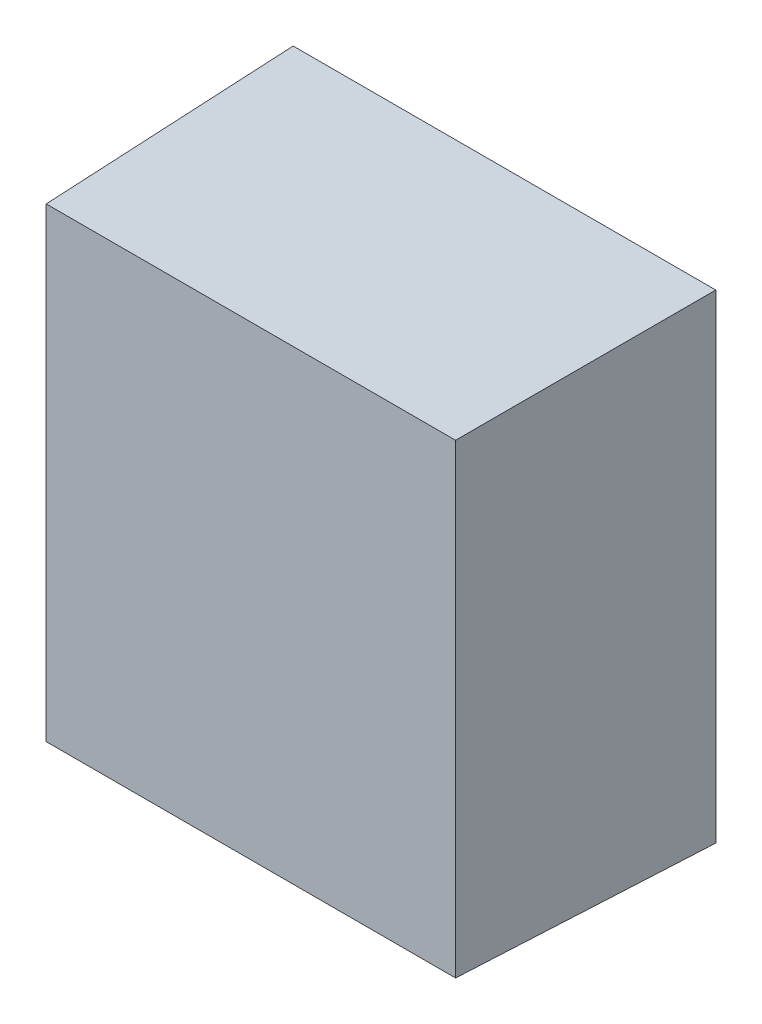
ISO-10303-21;
HEADER;
FILE_DESCRIPTION(('STEP AP214'),'2;1');
FILE_NAME('part.step','',(''),(''),'','','');
FILE_SCHEMA(('AUTOMOTIVE_DESIGN { 1 0 10303 214 1 1 1 1 }'));
ENDSEC;
DATA;
#1=APPLICATION_CONTEXT('core data for automotive mechanical design processes');
#2=APPLICATION_PROTOCOL_DEFINITION('international standard','automotive_design',2000,#1);
#3=PRODUCT_CONTEXT('',#1,'mechanical');
#4=PRODUCT('Part','Part','',(#3));
#5=PRODUCT_RELATED_PRODUCT_CATEGORY('part','',(#4));
#6=PRODUCT_DEFINITION_FORMATION('','',#4);
#7=PRODUCT_DEFINITION_CONTEXT('part definition',#1,'design');
#8=PRODUCT_DEFINITION('design','',#6,#7);
#9=PRODUCT_DEFINITION_SHAPE('','',#8);
#10=(LENGTH_UNIT() NAMED_UNIT(*) SI_UNIT(.MILLI.,.METRE.));
#11=(NAMED_UNIT(*) PLANE_ANGLE_UNIT() SI_UNIT($,.RADIAN.));
#12=(NAMED_UNIT(*) SI_UNIT($,.STERADIAN.) SOLID_ANGLE_UNIT());
#13=UNCERTAINTY_MEASURE_WITH_UNIT(LENGTH_MEASURE(1.E-05),#10,'distance_accuracy_value','');
#14=(GEOMETRIC_REPRESENTATION_CONTEXT(3) GLOBAL_UNCERTAINTY_ASSIGNED_CONTEXT((#13)) GLOBAL_UNIT_ASSIGNED_CONTEXT((#10,
#11,#12)) REPRESENTATION_CONTEXT('',''));
#15=CARTESIAN_POINT('',(0.,0.,0.));
#16=DIRECTION('',(0.,0.,1.));
#17=DIRECTION('',(1.,0.,0.));
#18=AXIS2_PLACEMENT_3D('',#15,#16,#17);
#19=CARTESIAN_POINT('',(-0.363216335294,0.413216335294,0.43));
#20=DIRECTION('',(0.,0.,-1.));
#21=DIRECTION('',(0.,-1.,0.));
#22=AXIS2_PLACEMENT_3D('',#19,#20,#21);
#23=PLANE('',#22);
#24=DIRECTION('',(0.,-1.,0.));
#25=VECTOR('',#24,1.);
#26=CARTESIAN_POINT('',(-0.343733197875,0.206608167647,0.43));
#27=LINE('',#26,#25);
#28=CARTESIAN_POINT('',(-0.343733197875,0.393733197875,0.43));
#29=VERTEX_POINT('',#28);
#30=CARTESIAN_POINT('',(-0.343733197875,-0.393733197875,0.43));
#31=VERTEX_POINT('',#30);
#32=EDGE_CURVE('E149',#29,#31,#27,.T.);
#33=ORIENTED_EDGE('',*,*,#32,.F.);
#34=DIRECTION('',(-1.,0.,0.));
#35=VECTOR('',#34,1.);
#36=CARTESIAN_POINT('',(-0.181608167647,0.393733197875,0.43));
#37=LINE('',#36,#35);
#38=CARTESIAN_POINT('',(0.343733197875,0.393733197875,0.43));
#39=VERTEX_POINT('',#38);
#40=EDGE_CURVE('E11',#39,#29,#37,.T.);
#41=ORIENTED_EDGE('',*,*,#40,.F.);
#42=DIRECTION('',(0.,1.,0.));
#43=VECTOR('',#42,1.);
#44=CARTESIAN_POINT('',(0.343733197875,0.206608167647,0.43));
#45=LINE('',#44,#43);
#46=CARTESIAN_POINT('',(0.343733197875,-0.393733197875,0.43));
#47=VERTEX_POINT('',#46);
#48=EDGE_CURVE('E164',#47,#39,#45,.T.);
#49=ORIENTED_EDGE('',*,*,#48,.F.);
#50=DIRECTION('',(1.,0.,0.));
#51=VECTOR('',#50,1.);
#52=CARTESIAN_POINT('',(-0.181608167647,-0.393733197875,0.43));
#53=LINE('',#52,#51);
#54=EDGE_CURVE('E157',#31,#47,#53,.T.);
#55=ORIENTED_EDGE('',*,*,#54,.F.);
#56=EDGE_LOOP('',(#33,#41,#49,#55));
#57=FACE_BOUND('',#56,.T.);
#58=ADVANCED_FACE('F17',(#57),#23,.T.);
#59=CARTESIAN_POINT('',(0.,0.399115021147,0.224476461034));
#60=DIRECTION('',(0.,0.999657324975558,0.0261769483078584));
#61=DIRECTION('',(1.,0.,0.));
#62=AXIS2_PLACEMENT_3D('',#59,#60,#61);
#63=PLANE('',#62);
#64=DIRECTION('',(-1.,0.,0.));
#65=VECTOR('',#64,1.);
#66=CARTESIAN_POINT('',(-0.1875,0.404993144149762,0.));
#67=LINE('',#66,#65);
#68=CARTESIAN_POINT('',(0.354993144346331,0.404993144346331,-5.01317968619001E-10));
#69=VERTEX_POINT('',#68);
#70=CARTESIAN_POINT('',(-0.354993144346331,0.404993144346331,-5.01317968619001E-10));
#71=VERTEX_POINT('',#70);
#72=EDGE_CURVE('E133',#69,#71,#67,.T.);
#73=ORIENTED_EDGE('',*,*,#72,.F.);
#74=DIRECTION('',(-0.0261679842649897,-0.0261679842649897,0.999315001988369));
#75=VECTOR('',#74,1.);
#76=CARTESIAN_POINT('',(0.348858840873,0.398858840873,0.234259591002));
#77=LINE('',#76,#75);
#78=EDGE_CURVE('E27',#69,#39,#77,.T.);
#79=ORIENTED_EDGE('',*,*,#78,.T.);
#80=ORIENTED_EDGE('',*,*,#40,.T.);
#81=DIRECTION('',(-0.0261679842649897,0.0261679842649897,-0.999315001988369));
#82=VECTOR('',#81,1.);
#83=CARTESIAN_POINT('',(-0.348858840873,0.398858840873,0.234259591002));
#84=LINE('',#83,#82);
#85=EDGE_CURVE('E143',#29,#71,#84,.T.);
#86=ORIENTED_EDGE('',*,*,#85,.T.);
#87=EDGE_LOOP('',(#73,#79,#80,#86));
#88=FACE_BOUND('',#87,.T.);
#89=ADVANCED_FACE('F215',(#88),#63,.F.);
#90=CARTESIAN_POINT('',(0.349115021147,0.,0.224476461034));
#91=DIRECTION('',(0.999657324975558,0.,0.0261769483078584));
#92=DIRECTION('',(0.,-1.,0.));
#93=AXIS2_PLACEMENT_3D('',#90,#91,#92);
#94=PLANE('',#93);
#95=DIRECTION('',(0.,1.,0.));
#96=VECTOR('',#95,1.);
#97=CARTESIAN_POINT('',(0.354993144149762,0.2125,0.));
#98=LINE('',#97,#96);
#99=CARTESIAN_POINT('',(0.354993144346331,-0.404993144346331,-5.01317957054178E-10));
#100=VERTEX_POINT('',#99);
#101=EDGE_CURVE('E108',#100,#69,#98,.T.);
#102=ORIENTED_EDGE('',*,*,#101,.F.);
#103=DIRECTION('',(-0.0261679842649897,0.0261679842649897,0.999315001988369));
#104=VECTOR('',#103,1.);
#105=CARTESIAN_POINT('',(0.348858840873,-0.398858840873,0.234259591002));
#106=LINE('',#105,#104);
#107=EDGE_CURVE('E161',#100,#47,#106,.T.);
#108=ORIENTED_EDGE('',*,*,#107,.T.);
#109=ORIENTED_EDGE('',*,*,#48,.T.);
#110=ORIENTED_EDGE('',*,*,#78,.F.);
#111=EDGE_LOOP('',(#102,#108,#109,#110));
#112=FACE_BOUND('',#111,.T.);
#113=ADVANCED_FACE('F19',(#112),#94,.F.);
#114=CARTESIAN_POINT('',(0.,-0.399115021147,0.224476461034));
#115=DIRECTION('',(0.,-0.999657324975558,0.0261769483078584));
#116=DIRECTION('',(-1.,0.,0.));
#117=AXIS2_PLACEMENT_3D('',#114,#115,#116);
#118=PLANE('',#117);
#119=DIRECTION('',(1.,0.,0.));
#120=VECTOR('',#119,1.);
#121=CARTESIAN_POINT('',(-0.1875,-0.404993144149762,0.));
#122=LINE('',#121,#120);
#123=CARTESIAN_POINT('',(-0.354993144346331,-0.404993144346331,-5.01317957054178E-10));
#124=VERTEX_POINT('',#123);
#125=EDGE_CURVE('E139',#124,#100,#122,.T.);
#126=ORIENTED_EDGE('',*,*,#125,.F.);
#127=DIRECTION('',(0.0261679842649897,0.0261679842649897,0.999315001988369));
#128=VECTOR('',#127,1.);
#129=CARTESIAN_POINT('',(-0.348858840873,-0.398858840873,0.234259591002));
#130=LINE('',#129,#128);
#131=EDGE_CURVE('E153',#124,#31,#130,.T.);
#132=ORIENTED_EDGE('',*,*,#131,.T.);
#133=ORIENTED_EDGE('',*,*,#54,.T.);
#134=ORIENTED_EDGE('',*,*,#107,.F.);
#135=EDGE_LOOP('',(#126,#132,#133,#134));
#136=FACE_BOUND('',#135,.T.);
#137=ADVANCED_FACE('F221',(#136),#118,.F.);
#138=CARTESIAN_POINT('',(-0.349115021147,0.,0.224476461034));
#139=DIRECTION('',(-0.999657324975558,0.,0.0261769483078584));
#140=DIRECTION('',(0.,1.,0.));
#141=AXIS2_PLACEMENT_3D('',#138,#139,#140);
#142=PLANE('',#141);
#143=DIRECTION('',(0.,-1.,0.));
#144=VECTOR('',#143,1.);
#145=CARTESIAN_POINT('',(-0.354993144149762,0.2125,0.));
#146=LINE('',#145,#144);
#147=EDGE_CURVE('E138',#71,#124,#146,.T.);
#148=ORIENTED_EDGE('',*,*,#147,.F.);
#149=ORIENTED_EDGE('',*,*,#85,.F.);
#150=ORIENTED_EDGE('',*,*,#32,.T.);
#151=ORIENTED_EDGE('',*,*,#131,.F.);
#152=EDGE_LOOP('',(#148,#149,#150,#151));
#153=FACE_BOUND('',#152,.T.);
#154=ADVANCED_FACE('F223',(#153),#142,.F.);
#155=CARTESIAN_POINT('',(-0.375,0.425,0.));
#156=DIRECTION('',(0.,0.,-1.));
#157=DIRECTION('',(0.,-1.,0.));
#158=AXIS2_PLACEMENT_3D('',#155,#156,#157);
#159=PLANE('',#158);
#160=ORIENTED_EDGE('',*,*,#101,.T.);
#161=ORIENTED_EDGE('',*,*,#72,.T.);
#162=ORIENTED_EDGE('',*,*,#147,.T.);
#163=ORIENTED_EDGE('',*,*,#125,.T.);
#164=EDGE_LOOP('',(#160,#161,#162,#163));
#165=FACE_BOUND('',#164,.T.);
#166=DIRECTION('',(0.,-1.,0.));
#167=VECTOR('',#166,1.);
#168=CARTESIAN_POINT('',(-0.375,0.425,0.));
#169=LINE('',#168,#167);
#170=CARTESIAN_POINT('',(-0.375,0.425,0.));
#171=VERTEX_POINT('',#170);
#172=CARTESIAN_POINT('',(-0.375,-0.425,0.));
#173=VERTEX_POINT('',#172);
#174=EDGE_CURVE('E192',#171,#173,#169,.T.);
#175=ORIENTED_EDGE('',*,*,#174,.F.);
#176=DIRECTION('',(-1.,0.,0.));
#177=VECTOR('',#176,1.);
#178=CARTESIAN_POINT('',(0.375,0.425,0.));
#179=LINE('',#178,#177);
#180=CARTESIAN_POINT('',(0.375,0.425,0.));
#181=VERTEX_POINT('',#180);
#182=EDGE_CURVE('E109',#181,#171,#179,.T.);
#183=ORIENTED_EDGE('',*,*,#182,.F.);
#184=DIRECTION('',(0.,1.,0.));
#185=VECTOR('',#184,1.);
#186=CARTESIAN_POINT('',(0.375,-0.425,0.));
#187=LINE('',#186,#185);
#188=CARTESIAN_POINT('',(0.375,-0.425,0.));
#189=VERTEX_POINT('',#188);
#190=EDGE_CURVE('E121',#189,#181,#187,.T.);
#191=ORIENTED_EDGE('',*,*,#190,.F.);
#192=DIRECTION('',(1.,0.,0.));
#193=VECTOR('',#192,1.);
#194=CARTESIAN_POINT('',(-0.375,-0.425,0.));
#195=LINE('',#194,#193);
#196=EDGE_CURVE('E179',#173,#189,#195,.T.);
#197=ORIENTED_EDGE('',*,*,#196,.F.);
#198=EDGE_LOOP('',(#175,#183,#191,#197));
#199=FACE_BOUND('',#198,.T.);
#200=ADVANCED_FACE('F201',(#165,#199),#159,.T.);
#201=CARTESIAN_POINT('',(-0.363216335294,0.413216335294,0.45));
#202=DIRECTION('',(0.,0.,-1.));
#203=DIRECTION('',(0.,-1.,0.));
#204=AXIS2_PLACEMENT_3D('',#201,#202,#203);
#205=PLANE('',#204);
#206=DIRECTION('',(0.,-1.,0.));
#207=VECTOR('',#206,1.);
#208=CARTESIAN_POINT('',(-0.363216335294,0.425,0.45));
#209=LINE('',#208,#207);
#210=CARTESIAN_POINT('',(-0.363216335294,0.413216335294,0.45));
#211=VERTEX_POINT('',#210);
#212=CARTESIAN_POINT('',(-0.363216335294,-0.413216335294,0.45));
#213=VERTEX_POINT('',#212);
#214=EDGE_CURVE('E185',#211,#213,#209,.T.);
#215=ORIENTED_EDGE('',*,*,#214,.T.);
#216=DIRECTION('',(1.,0.,0.));
#217=VECTOR('',#216,1.);
#218=CARTESIAN_POINT('',(-0.375,-0.413216335294,0.45));
#219=LINE('',#218,#217);
#220=CARTESIAN_POINT('',(0.363216335294,-0.413216335294,0.45));
#221=VERTEX_POINT('',#220);
#222=EDGE_CURVE('E114',#213,#221,#219,.T.);
#223=ORIENTED_EDGE('',*,*,#222,.T.);
#224=DIRECTION('',(0.,1.,0.));
#225=VECTOR('',#224,1.);
#226=CARTESIAN_POINT('',(0.363216335294,-0.425,0.45));
#227=LINE('',#226,#225);
#228=CARTESIAN_POINT('',(0.363216335294,0.413216335294,0.45));
#229=VERTEX_POINT('',#228);
#230=EDGE_CURVE('E112',#221,#229,#227,.T.);
#231=ORIENTED_EDGE('',*,*,#230,.T.);
#232=DIRECTION('',(-1.,0.,0.));
#233=VECTOR('',#232,1.);
#234=CARTESIAN_POINT('',(0.375,0.413216335294,0.45));
#235=LINE('',#234,#233);
#236=EDGE_CURVE('E96',#229,#211,#235,.T.);
#237=ORIENTED_EDGE('',*,*,#236,.T.);
#238=EDGE_LOOP('',(#215,#223,#231,#237));
#239=FACE_BOUND('',#238,.T.);
#240=ADVANCED_FACE('F113',(#239),#205,.F.);
#241=CARTESIAN_POINT('',(0.,0.425,0.));
#242=DIRECTION('',(0.,0.999657324975565,0.0261769483075755));
#243=DIRECTION('',(1.,0.,0.));
#244=AXIS2_PLACEMENT_3D('',#241,#242,#243);
#245=PLANE('',#244);
#246=ORIENTED_EDGE('',*,*,#182,.T.);
#247=DIRECTION('',(0.026167984264682,-0.026167984264682,0.999315001988385));
#248=VECTOR('',#247,1.);
#249=CARTESIAN_POINT('',(-0.375,0.425,0.));
#250=LINE('',#249,#248);
#251=EDGE_CURVE('E103',#171,#211,#250,.T.);
#252=ORIENTED_EDGE('',*,*,#251,.T.);
#253=ORIENTED_EDGE('',*,*,#236,.F.);
#254=DIRECTION('',(-0.026167984264682,-0.026167984264682,0.999315001988385));
#255=VECTOR('',#254,1.);
#256=CARTESIAN_POINT('',(0.375,0.425,0.));
#257=LINE('',#256,#255);
#258=EDGE_CURVE('E100',#181,#229,#257,.T.);
#259=ORIENTED_EDGE('',*,*,#258,.F.);
#260=EDGE_LOOP('',(#246,#252,#253,#259));
#261=FACE_BOUND('',#260,.T.);
#262=ADVANCED_FACE('F98',(#261),#245,.T.);
#263=CARTESIAN_POINT('',(0.375,0.,0.));
#264=DIRECTION('',(0.999657324975565,0.,0.0261769483075755));
#265=DIRECTION('',(0.,-1.,0.));
#266=AXIS2_PLACEMENT_3D('',#263,#264,#265);
#267=PLANE('',#266);
#268=ORIENTED_EDGE('',*,*,#190,.T.);
#269=ORIENTED_EDGE('',*,*,#258,.T.);
#270=ORIENTED_EDGE('',*,*,#230,.F.);
#271=DIRECTION('',(-0.026167984264682,0.026167984264682,0.999315001988385));
#272=VECTOR('',#271,1.);
#273=CARTESIAN_POINT('',(0.375,-0.425,0.));
#274=LINE('',#273,#272);
#275=EDGE_CURVE('E176',#189,#221,#274,.T.);
#276=ORIENTED_EDGE('',*,*,#275,.F.);
#277=EDGE_LOOP('',(#268,#269,#270,#276));
#278=FACE_BOUND('',#277,.T.);
#279=ADVANCED_FACE('F120',(#278),#267,.T.);
#280=CARTESIAN_POINT('',(0.,-0.425,0.));
#281=DIRECTION('',(0.,-0.999657324975565,0.0261769483075755));
#282=DIRECTION('',(-1.,0.,0.));
#283=AXIS2_PLACEMENT_3D('',#280,#281,#282);
#284=PLANE('',#283);
#285=ORIENTED_EDGE('',*,*,#196,.T.);
#286=ORIENTED_EDGE('',*,*,#275,.T.);
#287=ORIENTED_EDGE('',*,*,#222,.F.);
#288=DIRECTION('',(0.026167984264682,0.026167984264682,0.999315001988385));
#289=VECTOR('',#288,1.);
#290=CARTESIAN_POINT('',(-0.375,-0.425,0.));
#291=LINE('',#290,#289);
#292=EDGE_CURVE('E188',#173,#213,#291,.T.);
#293=ORIENTED_EDGE('',*,*,#292,.F.);
#294=EDGE_LOOP('',(#285,#286,#287,#293));
#295=FACE_BOUND('',#294,.T.);
#296=ADVANCED_FACE('F203',(#295),#284,.T.);
#297=CARTESIAN_POINT('',(-0.375,0.,0.));
#298=DIRECTION('',(-0.999657324975565,0.,0.0261769483075755));
#299=DIRECTION('',(0.,1.,0.));
#300=AXIS2_PLACEMENT_3D('',#297,#298,#299);
#301=PLANE('',#300);
#302=ORIENTED_EDGE('',*,*,#174,.T.);
#303=ORIENTED_EDGE('',*,*,#292,.T.);
#304=ORIENTED_EDGE('',*,*,#214,.F.);
#305=ORIENTED_EDGE('',*,*,#251,.F.);
#306=EDGE_LOOP('',(#302,#303,#304,#305));
#307=FACE_BOUND('',#306,.T.);
#308=ADVANCED_FACE('F198',(#307),#301,.T.);
#309=CLOSED_SHELL('',(#58,#89,#113,#137,#154,#200,#240,#262,#279,#296,#308));
#310=MANIFOLD_SOLID_BREP('B1',#309);
#311=ADVANCED_BREP_SHAPE_REPRESENTATION('',(#18,#310),#14);
#312=SHAPE_DEFINITION_REPRESENTATION(#9,#311);
ENDSEC;
END-ISO-10303-21;
